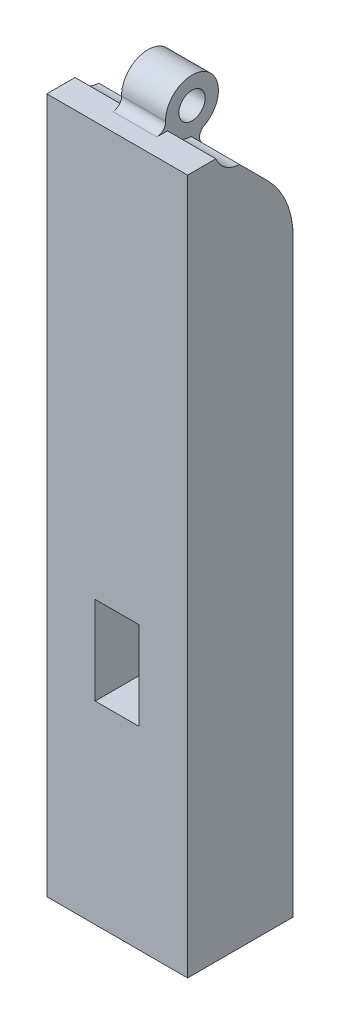
ISO-10303-21;
HEADER;
FILE_DESCRIPTION(('STEP AP214'),'2;1');
FILE_NAME('part.step','',(''),(''),'','','');
FILE_SCHEMA(('AUTOMOTIVE_DESIGN { 1 0 10303 214 1 1 1 1 }'));
ENDSEC;
DATA;
#1=APPLICATION_CONTEXT('core data for automotive mechanical design processes');
#2=APPLICATION_PROTOCOL_DEFINITION('international standard','automotive_design',2000,#1);
#3=PRODUCT_CONTEXT('',#1,'mechanical');
#4=PRODUCT('Part','Part','',(#3));
#5=PRODUCT_RELATED_PRODUCT_CATEGORY('part','',(#4));
#6=PRODUCT_DEFINITION_FORMATION('','',#4);
#7=PRODUCT_DEFINITION_CONTEXT('part definition',#1,'design');
#8=PRODUCT_DEFINITION('design','',#6,#7);
#9=PRODUCT_DEFINITION_SHAPE('','',#8);
#10=(LENGTH_UNIT() NAMED_UNIT(*) SI_UNIT(.MILLI.,.METRE.));
#11=(NAMED_UNIT(*) PLANE_ANGLE_UNIT() SI_UNIT($,.RADIAN.));
#12=(NAMED_UNIT(*) SI_UNIT($,.STERADIAN.) SOLID_ANGLE_UNIT());
#13=UNCERTAINTY_MEASURE_WITH_UNIT(LENGTH_MEASURE(1.E-05),#10,'distance_accuracy_value','');
#14=(GEOMETRIC_REPRESENTATION_CONTEXT(3) GLOBAL_UNCERTAINTY_ASSIGNED_CONTEXT((#13)) GLOBAL_UNIT_ASSIGNED_CONTEXT((#10,
#11,#12)) REPRESENTATION_CONTEXT('',''));
#15=CARTESIAN_POINT('',(0.,0.,0.));
#16=DIRECTION('',(0.,0.,1.));
#17=DIRECTION('',(1.,0.,0.));
#18=AXIS2_PLACEMENT_3D('',#15,#16,#17);
#19=CARTESIAN_POINT('',(0.,0.,0.));
#20=DIRECTION('',(0.,0.,-1.));
#21=DIRECTION('',(-1.,0.,0.));
#22=AXIS2_PLACEMENT_3D('',#19,#20,#21);
#23=PLANE('',#22);
#24=DIRECTION('',(-1.,0.,0.));
#25=VECTOR('',#24,1.);
#26=CARTESIAN_POINT('',(0.,-37.,0.));
#27=LINE('',#26,#25);
#28=CARTESIAN_POINT('',(2.50000000000001,-37.,0.));
#29=VERTEX_POINT('',#28);
#30=CARTESIAN_POINT('',(-2.49999999999999,-37.,0.));
#31=VERTEX_POINT('',#30);
#32=EDGE_CURVE('E261',#29,#31,#27,.T.);
#33=ORIENTED_EDGE('',*,*,#32,.F.);
#34=DIRECTION('',(0.,1.,0.));
#35=VECTOR('',#34,1.);
#36=CARTESIAN_POINT('',(2.5,0.,0.));
#37=LINE('',#36,#35);
#38=CARTESIAN_POINT('',(2.50000000000001,-27.,0.));
#39=VERTEX_POINT('',#38);
#40=EDGE_CURVE('E254',#29,#39,#37,.T.);
#41=ORIENTED_EDGE('',*,*,#40,.T.);
#42=DIRECTION('',(-1.,0.,0.));
#43=VECTOR('',#42,1.);
#44=CARTESIAN_POINT('',(0.,-27.,0.));
#45=LINE('',#44,#43);
#46=CARTESIAN_POINT('',(-2.49999999999999,-27.,0.));
#47=VERTEX_POINT('',#46);
#48=EDGE_CURVE('E267',#39,#47,#45,.T.);
#49=ORIENTED_EDGE('',*,*,#48,.T.);
#50=DIRECTION('',(0.,1.,0.));
#51=VECTOR('',#50,1.);
#52=CARTESIAN_POINT('',(-2.49999999999998,0.,0.));
#53=LINE('',#52,#51);
#54=EDGE_CURVE('E264',#31,#47,#53,.T.);
#55=ORIENTED_EDGE('',*,*,#54,.F.);
#56=EDGE_LOOP('',(#33,#41,#49,#55));
#57=FACE_BOUND('',#56,.T.);
#58=DIRECTION('',(0.,-1.,0.));
#59=VECTOR('',#58,1.);
#60=CARTESIAN_POINT('',(-8.,-79.,0.));
#61=LINE('',#60,#59);
#62=CARTESIAN_POINT('',(-8.,-12.1421356237309,0.));
#63=VERTEX_POINT('',#62);
#64=CARTESIAN_POINT('',(-8.,-79.,0.));
#65=VERTEX_POINT('',#64);
#66=EDGE_CURVE('E362',#63,#65,#61,.T.);
#67=ORIENTED_EDGE('',*,*,#66,.F.);
#68=DIRECTION('',(1.,0.,0.));
#69=VECTOR('',#68,1.);
#70=CARTESIAN_POINT('',(8.,-12.1421356237309,0.));
#71=LINE('',#70,#69);
#72=CARTESIAN_POINT('',(8.,-12.1421356237309,0.));
#73=VERTEX_POINT('',#72);
#74=EDGE_CURVE('E427',#63,#73,#71,.T.);
#75=ORIENTED_EDGE('',*,*,#74,.T.);
#76=DIRECTION('',(0.,1.,0.));
#77=VECTOR('',#76,1.);
#78=CARTESIAN_POINT('',(8.,0.,0.));
#79=LINE('',#78,#77);
#80=CARTESIAN_POINT('',(8.00000000000001,-79.,0.));
#81=VERTEX_POINT('',#80);
#82=EDGE_CURVE('E343',#81,#73,#79,.T.);
#83=ORIENTED_EDGE('',*,*,#82,.F.);
#84=DIRECTION('',(1.,0.,0.));
#85=VECTOR('',#84,1.);
#86=CARTESIAN_POINT('',(8.00000000000001,-79.,0.));
#87=LINE('',#86,#85);
#88=EDGE_CURVE('E349',#65,#81,#87,.T.);
#89=ORIENTED_EDGE('',*,*,#88,.F.);
#90=EDGE_LOOP('',(#67,#75,#83,#89));
#91=FACE_BOUND('',#90,.T.);
#92=DIRECTION('',(-1.,0.,0.));
#93=VECTOR('',#92,1.);
#94=CARTESIAN_POINT('',(0.,-47.,0.));
#95=LINE('',#94,#93);
#96=CARTESIAN_POINT('',(2.50000000000001,-47.,0.));
#97=VERTEX_POINT('',#96);
#98=CARTESIAN_POINT('',(-2.49999999999999,-47.,0.));
#99=VERTEX_POINT('',#98);
#100=EDGE_CURVE('E289',#97,#99,#95,.T.);
#101=ORIENTED_EDGE('',*,*,#100,.T.);
#102=DIRECTION('',(0.,-1.,0.));
#103=VECTOR('',#102,1.);
#104=CARTESIAN_POINT('',(-2.5,0.,0.));
#105=LINE('',#104,#103);
#106=CARTESIAN_POINT('',(-2.49999999999999,-57.,0.));
#107=VERTEX_POINT('',#106);
#108=EDGE_CURVE('E243',#99,#107,#105,.T.);
#109=ORIENTED_EDGE('',*,*,#108,.T.);
#110=DIRECTION('',(-1.,0.,0.));
#111=VECTOR('',#110,1.);
#112=CARTESIAN_POINT('',(0.,-57.,0.));
#113=LINE('',#112,#111);
#114=CARTESIAN_POINT('',(2.50000000000001,-57.,0.));
#115=VERTEX_POINT('',#114);
#116=EDGE_CURVE('E295',#115,#107,#113,.T.);
#117=ORIENTED_EDGE('',*,*,#116,.F.);
#118=DIRECTION('',(0.,-1.,0.));
#119=VECTOR('',#118,1.);
#120=CARTESIAN_POINT('',(2.50000000000002,0.,0.));
#121=LINE('',#120,#119);
#122=EDGE_CURVE('E202',#97,#115,#121,.T.);
#123=ORIENTED_EDGE('',*,*,#122,.F.);
#124=EDGE_LOOP('',(#101,#109,#117,#123));
#125=FACE_BOUND('',#124,.T.);
#126=ADVANCED_FACE('F38',(#57,#91,#125),#23,.T.);
#127=CARTESIAN_POINT('',(-8.,1.1,6.));
#128=DIRECTION('',(1.,0.,0.));
#129=DIRECTION('',(0.,0.,-1.));
#130=AXIS2_PLACEMENT_3D('',#127,#128,#129);
#131=CYLINDRICAL_SURFACE('',#130,3.);
#132=CARTESIAN_POINT('',(-2.5,1.1,6.));
#133=DIRECTION('',(1.,0.,0.));
#134=DIRECTION('',(0.,0.,-1.));
#135=AXIS2_PLACEMENT_3D('',#132,#133,#134);
#136=CIRCLE('',#135,3.);
#137=CARTESIAN_POINT('',(-2.5,0.,8.79105714739057));
#138=VERTEX_POINT('',#137);
#139=CARTESIAN_POINT('',(-2.5,-1.89827483579603,6.10172516420397));
#140=VERTEX_POINT('',#139);
#141=EDGE_CURVE('E319',#138,#140,#136,.T.);
#142=ORIENTED_EDGE('',*,*,#141,.T.);
#143=DIRECTION('',(1.,0.,0.));
#144=VECTOR('',#143,1.);
#145=CARTESIAN_POINT('',(-8.,-1.89827483579603,6.10172516420397));
#146=LINE('',#145,#144);
#147=CARTESIAN_POINT('',(-8.,-1.89827483579602,6.10172516420397));
#148=VERTEX_POINT('',#147);
#149=EDGE_CURVE('E383',#148,#140,#146,.T.);
#150=ORIENTED_EDGE('',*,*,#149,.F.);
#151=CARTESIAN_POINT('',(-8.,1.1,6.));
#152=DIRECTION('',(1.,0.,0.));
#153=DIRECTION('',(0.,0.,-1.));
#154=AXIS2_PLACEMENT_3D('',#151,#152,#153);
#155=CIRCLE('',#154,3.);
#156=CARTESIAN_POINT('',(-8.,0.,8.79105714739057));
#157=VERTEX_POINT('',#156);
#158=EDGE_CURVE('E326',#157,#148,#155,.T.);
#159=ORIENTED_EDGE('',*,*,#158,.F.);
#160=DIRECTION('',(1.,0.,0.));
#161=VECTOR('',#160,1.);
#162=CARTESIAN_POINT('',(-8.,0.,8.79105714739057));
#163=LINE('',#162,#161);
#164=EDGE_CURVE('E330',#138,#157,#163,.F.);
#165=ORIENTED_EDGE('',*,*,#164,.F.);
#166=EDGE_LOOP('',(#142,#150,#159,#165));
#167=FACE_BOUND('',#166,.T.);
#168=ADVANCED_FACE('F468',(#167),#131,.F.);
#169=CARTESIAN_POINT('',(8.,0.,12.));
#170=DIRECTION('',(-1.,0.,0.));
#171=DIRECTION('',(0.,-1.,0.));
#172=AXIS2_PLACEMENT_3D('',#169,#170,#171);
#173=PLANE('',#172);
#174=ORIENTED_EDGE('',*,*,#82,.T.);
#175=CARTESIAN_POINT('',(8.,-12.1421356237309,10.));
#176=DIRECTION('',(-1.,0.,0.));
#177=DIRECTION('',(0.,-1.,0.));
#178=AXIS2_PLACEMENT_3D('',#175,#176,#177);
#179=CIRCLE('',#178,10.);
#180=CARTESIAN_POINT('',(8.00000000000001,-5.07106781186547,2.92893218813453));
#181=VERTEX_POINT('',#180);
#182=EDGE_CURVE('E431',#73,#181,#179,.F.);
#183=ORIENTED_EDGE('',*,*,#182,.T.);
#184=DIRECTION('',(0.,-0.707106781186547,-0.707106781186548));
#185=VECTOR('',#184,1.);
#186=CARTESIAN_POINT('',(8.00000000000001,0.,8.));
#187=LINE('',#186,#185);
#188=CARTESIAN_POINT('',(8.00000000000001,-1.89827483579603,6.10172516420397));
#189=VERTEX_POINT('',#188);
#190=EDGE_CURVE('E335',#189,#181,#187,.T.);
#191=ORIENTED_EDGE('',*,*,#190,.F.);
#192=CARTESIAN_POINT('',(8.00000000000001,1.1,6.));
#193=DIRECTION('',(1.,0.,0.));
#194=DIRECTION('',(0.,0.,-1.));
#195=AXIS2_PLACEMENT_3D('',#192,#193,#194);
#196=CIRCLE('',#195,3.);
#197=CARTESIAN_POINT('',(8.00000000000001,0.,8.79105714739057));
#198=VERTEX_POINT('',#197);
#199=EDGE_CURVE('E317',#198,#189,#196,.T.);
#200=ORIENTED_EDGE('',*,*,#199,.F.);
#201=DIRECTION('',(0.,0.,-1.));
#202=VECTOR('',#201,1.);
#203=CARTESIAN_POINT('',(8.,0.,12.));
#204=LINE('',#203,#202);
#205=CARTESIAN_POINT('',(8.,0.,12.));
#206=VERTEX_POINT('',#205);
#207=EDGE_CURVE('E378',#206,#198,#204,.T.);
#208=ORIENTED_EDGE('',*,*,#207,.F.);
#209=DIRECTION('',(0.,1.,0.));
#210=VECTOR('',#209,1.);
#211=CARTESIAN_POINT('',(8.,0.,12.));
#212=LINE('',#211,#210);
#213=CARTESIAN_POINT('',(8.00000000000001,-79.,12.));
#214=VERTEX_POINT('',#213);
#215=EDGE_CURVE('E344',#214,#206,#212,.T.);
#216=ORIENTED_EDGE('',*,*,#215,.F.);
#217=DIRECTION('',(0.,0.,-1.));
#218=VECTOR('',#217,1.);
#219=CARTESIAN_POINT('',(8.00000000000001,-79.,12.));
#220=LINE('',#219,#218);
#221=EDGE_CURVE('E358',#214,#81,#220,.T.);
#222=ORIENTED_EDGE('',*,*,#221,.T.);
#223=EDGE_LOOP('',(#174,#183,#191,#200,#208,#216,#222));
#224=FACE_BOUND('',#223,.T.);
#225=ADVANCED_FACE('F451',(#224),#173,.F.);
#226=CARTESIAN_POINT('',(-8.,0.,12.));
#227=DIRECTION('',(0.,-1.,0.));
#228=DIRECTION('',(1.,0.,0.));
#229=AXIS2_PLACEMENT_3D('',#226,#227,#228);
#230=PLANE('',#229);
#231=DIRECTION('',(1.,0.,0.));
#232=VECTOR('',#231,1.);
#233=CARTESIAN_POINT('',(-2.5,0.,9.99874980462644));
#234=LINE('',#233,#232);
#235=CARTESIAN_POINT('',(2.5,0.,9.99874980462644));
#236=VERTEX_POINT('',#235);
#237=CARTESIAN_POINT('',(-2.5,0.,9.99874980462644));
#238=VERTEX_POINT('',#237);
#239=EDGE_CURVE('E391',#236,#238,#234,.F.);
#240=ORIENTED_EDGE('',*,*,#239,.T.);
#241=DIRECTION('',(0.,0.,-1.));
#242=VECTOR('',#241,1.);
#243=CARTESIAN_POINT('',(-2.5,0.,6.));
#244=LINE('',#243,#242);
#245=EDGE_CURVE('E395',#238,#138,#244,.T.);
#246=ORIENTED_EDGE('',*,*,#245,.T.);
#247=ORIENTED_EDGE('',*,*,#164,.T.);
#248=DIRECTION('',(0.,0.,-1.));
#249=VECTOR('',#248,1.);
#250=CARTESIAN_POINT('',(-8.,0.,12.));
#251=LINE('',#250,#249);
#252=CARTESIAN_POINT('',(-8.,0.,12.));
#253=VERTEX_POINT('',#252);
#254=EDGE_CURVE('E374',#253,#157,#251,.T.);
#255=ORIENTED_EDGE('',*,*,#254,.F.);
#256=DIRECTION('',(-1.,0.,0.));
#257=VECTOR('',#256,1.);
#258=CARTESIAN_POINT('',(-8.,0.,12.));
#259=LINE('',#258,#257);
#260=EDGE_CURVE('E348',#206,#253,#259,.T.);
#261=ORIENTED_EDGE('',*,*,#260,.F.);
#262=ORIENTED_EDGE('',*,*,#207,.T.);
#263=CARTESIAN_POINT('',(2.5,0.,8.79105714739057));
#264=VERTEX_POINT('',#263);
#265=EDGE_CURVE('E331',#198,#264,#163,.F.);
#266=ORIENTED_EDGE('',*,*,#265,.T.);
#267=DIRECTION('',(0.,0.,1.));
#268=VECTOR('',#267,1.);
#269=CARTESIAN_POINT('',(2.5,0.,12.));
#270=LINE('',#269,#268);
#271=EDGE_CURVE('E387',#264,#236,#270,.T.);
#272=ORIENTED_EDGE('',*,*,#271,.T.);
#273=EDGE_LOOP('',(#240,#246,#247,#255,#261,#262,#266,#272));
#274=FACE_BOUND('',#273,.T.);
#275=ADVANCED_FACE('F462',(#274),#230,.F.);
#276=CARTESIAN_POINT('',(-8.,-79.,12.));
#277=DIRECTION('',(1.,0.,0.));
#278=DIRECTION('',(0.,0.,-1.));
#279=AXIS2_PLACEMENT_3D('',#276,#277,#278);
#280=PLANE('',#279);
#281=DIRECTION('',(0.,-0.707106781186547,-0.707106781186548));
#282=VECTOR('',#281,1.);
#283=CARTESIAN_POINT('',(-8.,0.,8.));
#284=LINE('',#283,#282);
#285=CARTESIAN_POINT('',(-8.,-5.07106781186547,2.92893218813453));
#286=VERTEX_POINT('',#285);
#287=EDGE_CURVE('E339',#148,#286,#284,.T.);
#288=ORIENTED_EDGE('',*,*,#287,.T.);
#289=CARTESIAN_POINT('',(-8.,-12.1421356237309,10.));
#290=DIRECTION('',(1.,0.,0.));
#291=DIRECTION('',(0.,0.,-1.));
#292=AXIS2_PLACEMENT_3D('',#289,#290,#291);
#293=CIRCLE('',#292,10.);
#294=EDGE_CURVE('E11',#286,#63,#293,.F.);
#295=ORIENTED_EDGE('',*,*,#294,.T.);
#296=ORIENTED_EDGE('',*,*,#66,.T.);
#297=DIRECTION('',(0.,0.,-1.));
#298=VECTOR('',#297,1.);
#299=CARTESIAN_POINT('',(-8.,-79.,12.));
#300=LINE('',#299,#298);
#301=CARTESIAN_POINT('',(-8.,-79.,12.));
#302=VERTEX_POINT('',#301);
#303=EDGE_CURVE('E370',#302,#65,#300,.T.);
#304=ORIENTED_EDGE('',*,*,#303,.F.);
#305=DIRECTION('',(0.,-1.,0.));
#306=VECTOR('',#305,1.);
#307=CARTESIAN_POINT('',(-8.,-79.,12.));
#308=LINE('',#307,#306);
#309=EDGE_CURVE('E352',#253,#302,#308,.T.);
#310=ORIENTED_EDGE('',*,*,#309,.F.);
#311=ORIENTED_EDGE('',*,*,#254,.T.);
#312=ORIENTED_EDGE('',*,*,#158,.T.);
#313=EDGE_LOOP('',(#288,#295,#296,#304,#310,#311,#312));
#314=FACE_BOUND('',#313,.T.);
#315=ADVANCED_FACE('F442',(#314),#280,.F.);
#316=CARTESIAN_POINT('',(8.00000000000001,-79.,12.));
#317=DIRECTION('',(0.,1.,0.));
#318=DIRECTION('',(0.,0.,1.));
#319=AXIS2_PLACEMENT_3D('',#316,#317,#318);
#320=PLANE('',#319);
#321=ORIENTED_EDGE('',*,*,#88,.T.);
#322=ORIENTED_EDGE('',*,*,#221,.F.);
#323=DIRECTION('',(1.,0.,0.));
#324=VECTOR('',#323,1.);
#325=CARTESIAN_POINT('',(8.00000000000001,-79.,12.));
#326=LINE('',#325,#324);
#327=EDGE_CURVE('E355',#302,#214,#326,.T.);
#328=ORIENTED_EDGE('',*,*,#327,.F.);
#329=ORIENTED_EDGE('',*,*,#303,.T.);
#330=EDGE_LOOP('',(#321,#322,#328,#329));
#331=FACE_BOUND('',#330,.T.);
#332=ADVANCED_FACE('F457',(#331),#320,.F.);
#333=CARTESIAN_POINT('',(0.,0.,12.));
#334=DIRECTION('',(0.,0.,-1.));
#335=DIRECTION('',(-1.,0.,0.));
#336=AXIS2_PLACEMENT_3D('',#333,#334,#335);
#337=PLANE('',#336);
#338=DIRECTION('',(1.,0.,0.));
#339=VECTOR('',#338,1.);
#340=CARTESIAN_POINT('',(2.50000000000001,-47.,12.));
#341=LINE('',#340,#339);
#342=CARTESIAN_POINT('',(-2.49999999999999,-47.,12.));
#343=VERTEX_POINT('',#342);
#344=CARTESIAN_POINT('',(2.50000000000001,-47.,12.));
#345=VERTEX_POINT('',#344);
#346=EDGE_CURVE('E218',#343,#345,#341,.T.);
#347=ORIENTED_EDGE('',*,*,#346,.T.);
#348=DIRECTION('',(0.,-1.,0.));
#349=VECTOR('',#348,1.);
#350=CARTESIAN_POINT('',(2.50000000000001,-47.,12.));
#351=LINE('',#350,#349);
#352=CARTESIAN_POINT('',(2.50000000000001,-57.,12.));
#353=VERTEX_POINT('',#352);
#354=EDGE_CURVE('E199',#345,#353,#351,.T.);
#355=ORIENTED_EDGE('',*,*,#354,.T.);
#356=DIRECTION('',(-1.,0.,0.));
#357=VECTOR('',#356,1.);
#358=CARTESIAN_POINT('',(2.50000000000001,-57.,12.));
#359=LINE('',#358,#357);
#360=CARTESIAN_POINT('',(-2.49999999999999,-57.,12.));
#361=VERTEX_POINT('',#360);
#362=EDGE_CURVE('E208',#353,#361,#359,.T.);
#363=ORIENTED_EDGE('',*,*,#362,.T.);
#364=DIRECTION('',(0.,1.,0.));
#365=VECTOR('',#364,1.);
#366=CARTESIAN_POINT('',(-2.49999999999999,-47.,12.));
#367=LINE('',#366,#365);
#368=EDGE_CURVE('E213',#361,#343,#367,.T.);
#369=ORIENTED_EDGE('',*,*,#368,.T.);
#370=EDGE_LOOP('',(#347,#355,#363,#369));
#371=FACE_BOUND('',#370,.T.);
#372=ORIENTED_EDGE('',*,*,#215,.T.);
#373=ORIENTED_EDGE('',*,*,#260,.T.);
#374=ORIENTED_EDGE('',*,*,#309,.T.);
#375=ORIENTED_EDGE('',*,*,#327,.T.);
#376=EDGE_LOOP('',(#372,#373,#374,#375));
#377=FACE_BOUND('',#376,.T.);
#378=ADVANCED_FACE('F215',(#371,#377),#337,.F.);
#379=CARTESIAN_POINT('',(-8.,0.,8.));
#380=DIRECTION('',(0.,-0.707106781186548,0.707106781186547));
#381=DIRECTION('',(0.,-0.707106781186547,-0.707106781186548));
#382=AXIS2_PLACEMENT_3D('',#379,#380,#381);
#383=PLANE('',#382);
#384=ORIENTED_EDGE('',*,*,#190,.T.);
#385=DIRECTION('',(1.,0.,0.));
#386=VECTOR('',#385,1.);
#387=CARTESIAN_POINT('',(-8.,-5.07106781186547,2.92893218813453));
#388=LINE('',#387,#386);
#389=EDGE_CURVE('E47',#181,#286,#388,.F.);
#390=ORIENTED_EDGE('',*,*,#389,.T.);
#391=ORIENTED_EDGE('',*,*,#287,.F.);
#392=ORIENTED_EDGE('',*,*,#149,.T.);
#393=DIRECTION('',(0.,-0.707106781186547,-0.707106781186548));
#394=VECTOR('',#393,1.);
#395=CARTESIAN_POINT('',(-2.5,-0.449999999999999,7.55));
#396=LINE('',#395,#394);
#397=CARTESIAN_POINT('',(-2.5,-3.14991315076583,4.85008684923416));
#398=VERTEX_POINT('',#397);
#399=EDGE_CURVE('E404',#140,#398,#396,.T.);
#400=ORIENTED_EDGE('',*,*,#399,.T.);
#401=DIRECTION('',(1.,0.,0.));
#402=VECTOR('',#401,1.);
#403=CARTESIAN_POINT('',(2.5,-3.14991315076583,4.85008684923416));
#404=LINE('',#403,#402);
#405=CARTESIAN_POINT('',(2.5,-3.14991315076583,4.85008684923416));
#406=VERTEX_POINT('',#405);
#407=EDGE_CURVE('E408',#398,#406,#404,.T.);
#408=ORIENTED_EDGE('',*,*,#407,.T.);
#409=DIRECTION('',(0.,0.707106781186547,0.707106781186548));
#410=VECTOR('',#409,1.);
#411=CARTESIAN_POINT('',(2.5,0.,8.));
#412=LINE('',#411,#410);
#413=CARTESIAN_POINT('',(2.5,-1.89827483579603,6.10172516420397));
#414=VERTEX_POINT('',#413);
#415=EDGE_CURVE('E412',#406,#414,#412,.T.);
#416=ORIENTED_EDGE('',*,*,#415,.T.);
#417=EDGE_CURVE('E382',#414,#189,#146,.T.);
#418=ORIENTED_EDGE('',*,*,#417,.T.);
#419=EDGE_LOOP('',(#384,#390,#391,#392,#400,#408,#416,#418));
#420=FACE_BOUND('',#419,.T.);
#421=ADVANCED_FACE('F437',(#420),#383,.F.);
#422=ORIENTED_EDGE('',*,*,#417,.F.);
#423=CARTESIAN_POINT('',(2.5,1.1,6.));
#424=DIRECTION('',(1.,0.,0.));
#425=DIRECTION('',(0.,0.,-1.));
#426=AXIS2_PLACEMENT_3D('',#423,#424,#425);
#427=CIRCLE('',#426,3.);
#428=EDGE_CURVE('E313',#264,#414,#427,.T.);
#429=ORIENTED_EDGE('',*,*,#428,.F.);
#430=ORIENTED_EDGE('',*,*,#265,.F.);
#431=ORIENTED_EDGE('',*,*,#199,.T.);
#432=EDGE_LOOP('',(#422,#429,#430,#431));
#433=FACE_BOUND('',#432,.T.);
#434=ADVANCED_FACE('F484',(#433),#131,.F.);
#435=CARTESIAN_POINT('',(2.5,1.1,6.));
#436=DIRECTION('',(-1.,0.,0.));
#437=DIRECTION('',(0.,0.,1.));
#438=AXIS2_PLACEMENT_3D('',#435,#436,#437);
#439=CYLINDRICAL_SURFACE('',#438,3.);
#440=CARTESIAN_POINT('',(-2.5,-1.55710477718447,4.60723505103571));
#441=VERTEX_POINT('',#440);
#442=CARTESIAN_POINT('',(-2.5,1.025,8.99906235346983));
#443=VERTEX_POINT('',#442);
#444=EDGE_CURVE('E309',#441,#443,#136,.T.);
#445=ORIENTED_EDGE('',*,*,#444,.T.);
#446=DIRECTION('',(-1.,0.,0.));
#447=VECTOR('',#446,1.);
#448=CARTESIAN_POINT('',(2.5,1.025,8.99906235346983));
#449=LINE('',#448,#447);
#450=CARTESIAN_POINT('',(2.5,1.025,8.99906235346983));
#451=VERTEX_POINT('',#450);
#452=EDGE_CURVE('E401',#443,#451,#449,.F.);
#453=ORIENTED_EDGE('',*,*,#452,.T.);
#454=CARTESIAN_POINT('',(2.5,-1.55710477718447,4.60723505103571));
#455=VERTEX_POINT('',#454);
#456=EDGE_CURVE('E318',#455,#451,#427,.T.);
#457=ORIENTED_EDGE('',*,*,#456,.F.);
#458=DIRECTION('',(-1.,0.,0.));
#459=VECTOR('',#458,1.);
#460=CARTESIAN_POINT('',(2.5,-1.55710477718447,4.60723505103571));
#461=LINE('',#460,#459);
#462=EDGE_CURVE('E398',#455,#441,#461,.T.);
#463=ORIENTED_EDGE('',*,*,#462,.T.);
#464=EDGE_LOOP('',(#445,#453,#457,#463));
#465=FACE_BOUND('',#464,.T.);
#466=ADVANCED_FACE('F493',(#465),#439,.T.);
#467=CARTESIAN_POINT('',(2.5,1.1,6.));
#468=DIRECTION('',(1.,0.,0.));
#469=DIRECTION('',(0.,0.,-1.));
#470=AXIS2_PLACEMENT_3D('',#467,#468,#469);
#471=PLANE('',#470);
#472=ORIENTED_EDGE('',*,*,#428,.T.);
#473=ORIENTED_EDGE('',*,*,#415,.F.);
#474=CARTESIAN_POINT('',(2.5,-2.44280636957929,4.14298006804762));
#475=DIRECTION('',(1.,0.,0.));
#476=DIRECTION('',(0.,0.,-1.));
#477=AXIS2_PLACEMENT_3D('',#474,#475,#476);
#478=CIRCLE('',#477,1.);
#479=EDGE_CURVE('E421',#406,#455,#478,.F.);
#480=ORIENTED_EDGE('',*,*,#479,.T.);
#481=ORIENTED_EDGE('',*,*,#456,.T.);
#482=CARTESIAN_POINT('',(2.5,1.,9.99874980462644));
#483=DIRECTION('',(1.,0.,0.));
#484=DIRECTION('',(0.,0.,-1.));
#485=AXIS2_PLACEMENT_3D('',#482,#483,#484);
#486=CIRCLE('',#485,1.);
#487=EDGE_CURVE('E418',#451,#236,#486,.F.);
#488=ORIENTED_EDGE('',*,*,#487,.T.);
#489=ORIENTED_EDGE('',*,*,#271,.F.);
#490=EDGE_LOOP('',(#472,#473,#480,#481,#488,#489));
#491=FACE_BOUND('',#490,.T.);
#492=CARTESIAN_POINT('',(2.5,1.1,6.));
#493=DIRECTION('',(1.,0.,0.));
#494=DIRECTION('',(0.,0.,-1.));
#495=AXIS2_PLACEMENT_3D('',#492,#493,#494);
#496=CIRCLE('',#495,1.5);
#497=CARTESIAN_POINT('',(2.5,1.1,4.5));
#498=VERTEX_POINT('',#497);
#499=EDGE_CURVE('E305',#498,#498,#496,.T.);
#500=ORIENTED_EDGE('',*,*,#499,.F.);
#501=EDGE_LOOP('',(#500));
#502=FACE_BOUND('',#501,.T.);
#503=ADVANCED_FACE('F479',(#491,#502),#471,.T.);
#504=CARTESIAN_POINT('',(-2.5,1.1,6.));
#505=DIRECTION('',(1.,0.,0.));
#506=DIRECTION('',(0.,0.,-1.));
#507=AXIS2_PLACEMENT_3D('',#504,#505,#506);
#508=PLANE('',#507);
#509=ORIENTED_EDGE('',*,*,#141,.F.);
#510=ORIENTED_EDGE('',*,*,#245,.F.);
#511=CARTESIAN_POINT('',(-2.5,1.,9.99874980462644));
#512=DIRECTION('',(1.,0.,0.));
#513=DIRECTION('',(0.,0.,-1.));
#514=AXIS2_PLACEMENT_3D('',#511,#512,#513);
#515=CIRCLE('',#514,1.);
#516=EDGE_CURVE('E415',#238,#443,#515,.T.);
#517=ORIENTED_EDGE('',*,*,#516,.T.);
#518=ORIENTED_EDGE('',*,*,#444,.F.);
#519=CARTESIAN_POINT('',(-2.5,-2.44280636957929,4.14298006804762));
#520=DIRECTION('',(1.,0.,0.));
#521=DIRECTION('',(0.,0.,-1.));
#522=AXIS2_PLACEMENT_3D('',#519,#520,#521);
#523=CIRCLE('',#522,1.);
#524=EDGE_CURVE('E424',#441,#398,#523,.T.);
#525=ORIENTED_EDGE('',*,*,#524,.T.);
#526=ORIENTED_EDGE('',*,*,#399,.F.);
#527=EDGE_LOOP('',(#509,#510,#517,#518,#525,#526));
#528=FACE_BOUND('',#527,.T.);
#529=CARTESIAN_POINT('',(-2.5,1.1,6.));
#530=DIRECTION('',(1.,0.,0.));
#531=DIRECTION('',(0.,0.,-1.));
#532=AXIS2_PLACEMENT_3D('',#529,#530,#531);
#533=CIRCLE('',#532,1.5);
#534=CARTESIAN_POINT('',(-2.5,1.1,4.5));
#535=VERTEX_POINT('',#534);
#536=EDGE_CURVE('E277',#535,#535,#533,.T.);
#537=ORIENTED_EDGE('',*,*,#536,.T.);
#538=EDGE_LOOP('',(#537));
#539=FACE_BOUND('',#538,.T.);
#540=ADVANCED_FACE('F498',(#528,#539),#508,.F.);
#541=CARTESIAN_POINT('',(2.5,1.1,6.));
#542=DIRECTION('',(-1.,0.,0.));
#543=DIRECTION('',(0.,0.,1.));
#544=AXIS2_PLACEMENT_3D('',#541,#542,#543);
#545=CYLINDRICAL_SURFACE('',#544,1.5);
#546=ORIENTED_EDGE('',*,*,#499,.T.);
#547=EDGE_LOOP('',(#546));
#548=FACE_BOUND('',#547,.T.);
#549=ORIENTED_EDGE('',*,*,#536,.F.);
#550=EDGE_LOOP('',(#549));
#551=FACE_BOUND('',#550,.T.);
#552=ADVANCED_FACE('F501',(#548,#551),#545,.F.);
#553=CARTESIAN_POINT('',(2.5,1.,9.99874980462644));
#554=DIRECTION('',(-1.,0.,0.));
#555=DIRECTION('',(0.,0.,1.));
#556=AXIS2_PLACEMENT_3D('',#553,#554,#555);
#557=CYLINDRICAL_SURFACE('',#556,1.);
#558=ORIENTED_EDGE('',*,*,#487,.F.);
#559=ORIENTED_EDGE('',*,*,#452,.F.);
#560=ORIENTED_EDGE('',*,*,#516,.F.);
#561=ORIENTED_EDGE('',*,*,#239,.F.);
#562=EDGE_LOOP('',(#558,#559,#560,#561));
#563=FACE_BOUND('',#562,.T.);
#564=ADVANCED_FACE('F496',(#563),#557,.F.);
#565=CARTESIAN_POINT('',(2.5,-2.44280636957929,4.14298006804762));
#566=DIRECTION('',(-1.,0.,0.));
#567=DIRECTION('',(0.,0.,1.));
#568=AXIS2_PLACEMENT_3D('',#565,#566,#567);
#569=CYLINDRICAL_SURFACE('',#568,1.);
#570=ORIENTED_EDGE('',*,*,#524,.F.);
#571=ORIENTED_EDGE('',*,*,#462,.F.);
#572=ORIENTED_EDGE('',*,*,#479,.F.);
#573=ORIENTED_EDGE('',*,*,#407,.F.);
#574=EDGE_LOOP('',(#570,#571,#572,#573));
#575=FACE_BOUND('',#574,.T.);
#576=ADVANCED_FACE('F473',(#575),#569,.F.);
#577=CARTESIAN_POINT('',(0.,-12.1421356237309,10.));
#578=DIRECTION('',(-1.,0.,0.));
#579=DIRECTION('',(0.,0.,1.));
#580=AXIS2_PLACEMENT_3D('',#577,#578,#579);
#581=CYLINDRICAL_SURFACE('',#580,10.);
#582=ORIENTED_EDGE('',*,*,#294,.F.);
#583=ORIENTED_EDGE('',*,*,#389,.F.);
#584=ORIENTED_EDGE('',*,*,#182,.F.);
#585=ORIENTED_EDGE('',*,*,#74,.F.);
#586=EDGE_LOOP('',(#582,#583,#584,#585));
#587=FACE_BOUND('',#586,.T.);
#588=ADVANCED_FACE('F40',(#587),#581,.T.);
#589=CARTESIAN_POINT('',(0.,-57.,5.));
#590=DIRECTION('',(0.,-1.,0.));
#591=DIRECTION('',(0.,0.,-1.));
#592=AXIS2_PLACEMENT_3D('',#589,#590,#591);
#593=PLANE('',#592);
#594=ORIENTED_EDGE('',*,*,#116,.T.);
#595=DIRECTION('',(0.,0.,-1.));
#596=VECTOR('',#595,1.);
#597=CARTESIAN_POINT('',(-2.49999999999999,-57.,5.));
#598=LINE('',#597,#596);
#599=EDGE_CURVE('E54',#361,#107,#598,.T.);
#600=ORIENTED_EDGE('',*,*,#599,.F.);
#601=ORIENTED_EDGE('',*,*,#362,.F.);
#602=DIRECTION('',(0.,0.,-1.));
#603=VECTOR('',#602,1.);
#604=CARTESIAN_POINT('',(2.50000000000001,-57.,5.));
#605=LINE('',#604,#603);
#606=EDGE_CURVE('E195',#353,#115,#605,.T.);
#607=ORIENTED_EDGE('',*,*,#606,.T.);
#608=EDGE_LOOP('',(#594,#600,#601,#607));
#609=FACE_BOUND('',#608,.T.);
#610=ADVANCED_FACE('F209',(#609),#593,.F.);
#611=CARTESIAN_POINT('',(0.,-47.,5.));
#612=DIRECTION('',(0.,-1.,0.));
#613=DIRECTION('',(0.,0.,-1.));
#614=AXIS2_PLACEMENT_3D('',#611,#612,#613);
#615=PLANE('',#614);
#616=DIRECTION('',(1.,0.,0.));
#617=VECTOR('',#616,1.);
#618=CARTESIAN_POINT('',(-2.49999999999999,-47.,2.5));
#619=LINE('',#618,#617);
#620=CARTESIAN_POINT('',(-2.49999999999999,-47.,2.5));
#621=VERTEX_POINT('',#620);
#622=CARTESIAN_POINT('',(2.50000000000001,-47.,2.5));
#623=VERTEX_POINT('',#622);
#624=EDGE_CURVE('E239',#621,#623,#619,.T.);
#625=ORIENTED_EDGE('',*,*,#624,.F.);
#626=DIRECTION('',(0.,0.,-1.));
#627=VECTOR('',#626,1.);
#628=CARTESIAN_POINT('',(-2.49999999999999,-47.,5.));
#629=LINE('',#628,#627);
#630=EDGE_CURVE('E298',#621,#99,#629,.T.);
#631=ORIENTED_EDGE('',*,*,#630,.T.);
#632=ORIENTED_EDGE('',*,*,#100,.F.);
#633=DIRECTION('',(0.,0.,-1.));
#634=VECTOR('',#633,1.);
#635=CARTESIAN_POINT('',(2.50000000000001,-47.,5.));
#636=LINE('',#635,#634);
#637=EDGE_CURVE('E205',#623,#97,#636,.T.);
#638=ORIENTED_EDGE('',*,*,#637,.F.);
#639=EDGE_LOOP('',(#625,#631,#632,#638));
#640=FACE_BOUND('',#639,.T.);
#641=ADVANCED_FACE('F541',(#640),#615,.T.);
#642=CARTESIAN_POINT('',(0.,-37.,5.));
#643=DIRECTION('',(0.,-1.,0.));
#644=DIRECTION('',(0.,0.,-1.));
#645=AXIS2_PLACEMENT_3D('',#642,#643,#644);
#646=PLANE('',#645);
#647=DIRECTION('',(0.,0.,-1.));
#648=VECTOR('',#647,1.);
#649=CARTESIAN_POINT('',(-2.49999999999999,-37.,5.));
#650=LINE('',#649,#648);
#651=CARTESIAN_POINT('',(-2.49999999999999,-37.,2.5));
#652=VERTEX_POINT('',#651);
#653=EDGE_CURVE('E62',#652,#31,#650,.T.);
#654=ORIENTED_EDGE('',*,*,#653,.F.);
#655=DIRECTION('',(-1.,0.,0.));
#656=VECTOR('',#655,1.);
#657=CARTESIAN_POINT('',(-2.49999999999999,-37.,2.5));
#658=LINE('',#657,#656);
#659=CARTESIAN_POINT('',(2.50000000000001,-37.,2.5));
#660=VERTEX_POINT('',#659);
#661=EDGE_CURVE('E235',#660,#652,#658,.T.);
#662=ORIENTED_EDGE('',*,*,#661,.F.);
#663=DIRECTION('',(0.,0.,-1.));
#664=VECTOR('',#663,1.);
#665=CARTESIAN_POINT('',(2.50000000000001,-37.,5.));
#666=LINE('',#665,#664);
#667=EDGE_CURVE('E274',#660,#29,#666,.T.);
#668=ORIENTED_EDGE('',*,*,#667,.T.);
#669=ORIENTED_EDGE('',*,*,#32,.T.);
#670=EDGE_LOOP('',(#654,#662,#668,#669));
#671=FACE_BOUND('',#670,.T.);
#672=ADVANCED_FACE('F546',(#671),#646,.F.);
#673=CARTESIAN_POINT('',(2.5,0.,5.));
#674=DIRECTION('',(-1.,0.,0.));
#675=DIRECTION('',(0.,-1.,0.));
#676=AXIS2_PLACEMENT_3D('',#673,#674,#675);
#677=PLANE('',#676);
#678=DIRECTION('',(0.,-1.,0.));
#679=VECTOR('',#678,1.);
#680=CARTESIAN_POINT('',(2.50000000000001,4.101,2.5));
#681=LINE('',#680,#679);
#682=EDGE_CURVE('E244',#660,#623,#681,.T.);
#683=ORIENTED_EDGE('',*,*,#682,.T.);
#684=ORIENTED_EDGE('',*,*,#637,.T.);
#685=ORIENTED_EDGE('',*,*,#122,.T.);
#686=ORIENTED_EDGE('',*,*,#606,.F.);
#687=ORIENTED_EDGE('',*,*,#354,.F.);
#688=DIRECTION('',(0.,0.,-1.));
#689=VECTOR('',#688,1.);
#690=CARTESIAN_POINT('',(2.50000000000001,-47.,12.));
#691=LINE('',#690,#689);
#692=CARTESIAN_POINT('',(2.50000000000001,-47.,5.));
#693=VERTEX_POINT('',#692);
#694=EDGE_CURVE('E227',#345,#693,#691,.T.);
#695=ORIENTED_EDGE('',*,*,#694,.T.);
#696=DIRECTION('',(0.,1.,0.));
#697=VECTOR('',#696,1.);
#698=CARTESIAN_POINT('',(2.5,0.,5.));
#699=LINE('',#698,#697);
#700=CARTESIAN_POINT('',(2.50000000000001,-27.,5.));
#701=VERTEX_POINT('',#700);
#702=EDGE_CURVE('E258',#693,#701,#699,.T.);
#703=ORIENTED_EDGE('',*,*,#702,.T.);
#704=DIRECTION('',(0.,0.,-1.));
#705=VECTOR('',#704,1.);
#706=CARTESIAN_POINT('',(2.50000000000001,-27.,5.));
#707=LINE('',#706,#705);
#708=EDGE_CURVE('E278',#701,#39,#707,.T.);
#709=ORIENTED_EDGE('',*,*,#708,.T.);
#710=ORIENTED_EDGE('',*,*,#40,.F.);
#711=ORIENTED_EDGE('',*,*,#667,.F.);
#712=EDGE_LOOP('',(#683,#684,#685,#686,#687,#695,#703,#709,#710,#711));
#713=FACE_BOUND('',#712,.T.);
#714=ADVANCED_FACE('F196',(#713),#677,.T.);
#715=CARTESIAN_POINT('',(0.,-27.,5.));
#716=DIRECTION('',(0.,-1.,0.));
#717=DIRECTION('',(0.,0.,-1.));
#718=AXIS2_PLACEMENT_3D('',#715,#716,#717);
#719=PLANE('',#718);
#720=ORIENTED_EDGE('',*,*,#48,.F.);
#721=ORIENTED_EDGE('',*,*,#708,.F.);
#722=DIRECTION('',(-1.,0.,0.));
#723=VECTOR('',#722,1.);
#724=CARTESIAN_POINT('',(0.,-27.,5.));
#725=LINE('',#724,#723);
#726=CARTESIAN_POINT('',(-2.49999999999999,-27.,5.));
#727=VERTEX_POINT('',#726);
#728=EDGE_CURVE('E253',#701,#727,#725,.T.);
#729=ORIENTED_EDGE('',*,*,#728,.T.);
#730=DIRECTION('',(0.,0.,-1.));
#731=VECTOR('',#730,1.);
#732=CARTESIAN_POINT('',(-2.49999999999999,-27.,5.));
#733=LINE('',#732,#731);
#734=EDGE_CURVE('E281',#727,#47,#733,.T.);
#735=ORIENTED_EDGE('',*,*,#734,.T.);
#736=EDGE_LOOP('',(#720,#721,#729,#735));
#737=FACE_BOUND('',#736,.T.);
#738=ADVANCED_FACE('F556',(#737),#719,.T.);
#739=CARTESIAN_POINT('',(-2.49999999999998,0.,5.));
#740=DIRECTION('',(-1.,0.,0.));
#741=DIRECTION('',(0.,-1.,0.));
#742=AXIS2_PLACEMENT_3D('',#739,#740,#741);
#743=PLANE('',#742);
#744=DIRECTION('',(0.,1.,0.));
#745=VECTOR('',#744,1.);
#746=CARTESIAN_POINT('',(-2.49999999999998,0.,5.));
#747=LINE('',#746,#745);
#748=CARTESIAN_POINT('',(-2.49999999999999,-47.,5.));
#749=VERTEX_POINT('',#748);
#750=EDGE_CURVE('E250',#749,#727,#747,.T.);
#751=ORIENTED_EDGE('',*,*,#750,.F.);
#752=DIRECTION('',(0.,0.,-1.));
#753=VECTOR('',#752,1.);
#754=CARTESIAN_POINT('',(-2.49999999999999,-47.,12.));
#755=LINE('',#754,#753);
#756=EDGE_CURVE('E226',#343,#749,#755,.T.);
#757=ORIENTED_EDGE('',*,*,#756,.F.);
#758=ORIENTED_EDGE('',*,*,#368,.F.);
#759=ORIENTED_EDGE('',*,*,#599,.T.);
#760=ORIENTED_EDGE('',*,*,#108,.F.);
#761=ORIENTED_EDGE('',*,*,#630,.F.);
#762=DIRECTION('',(0.,-1.,0.));
#763=VECTOR('',#762,1.);
#764=CARTESIAN_POINT('',(-2.49999999999999,4.101,2.5));
#765=LINE('',#764,#763);
#766=EDGE_CURVE('E240',#652,#621,#765,.T.);
#767=ORIENTED_EDGE('',*,*,#766,.F.);
#768=ORIENTED_EDGE('',*,*,#653,.T.);
#769=ORIENTED_EDGE('',*,*,#54,.T.);
#770=ORIENTED_EDGE('',*,*,#734,.F.);
#771=EDGE_LOOP('',(#751,#757,#758,#759,#760,#761,#767,#768,#769,#770));
#772=FACE_BOUND('',#771,.T.);
#773=ADVANCED_FACE('F552',(#772),#743,.F.);
#774=CARTESIAN_POINT('',(0.,0.,5.));
#775=DIRECTION('',(0.,0.,-1.));
#776=DIRECTION('',(-1.,0.,0.));
#777=AXIS2_PLACEMENT_3D('',#774,#775,#776);
#778=PLANE('',#777);
#779=DIRECTION('',(1.,0.,0.));
#780=VECTOR('',#779,1.);
#781=CARTESIAN_POINT('',(0.,-47.,5.));
#782=LINE('',#781,#780);
#783=EDGE_CURVE('E230',#749,#693,#782,.T.);
#784=ORIENTED_EDGE('',*,*,#783,.F.);
#785=ORIENTED_EDGE('',*,*,#750,.T.);
#786=ORIENTED_EDGE('',*,*,#728,.F.);
#787=ORIENTED_EDGE('',*,*,#702,.F.);
#788=EDGE_LOOP('',(#784,#785,#786,#787));
#789=FACE_BOUND('',#788,.T.);
#790=ADVANCED_FACE('F555',(#789),#778,.T.);
#791=CARTESIAN_POINT('',(-2.49999999999999,4.101,2.5));
#792=DIRECTION('',(0.,0.,-1.));
#793=DIRECTION('',(-1.,0.,0.));
#794=AXIS2_PLACEMENT_3D('',#791,#792,#793);
#795=PLANE('',#794);
#796=ORIENTED_EDGE('',*,*,#661,.T.);
#797=ORIENTED_EDGE('',*,*,#766,.T.);
#798=ORIENTED_EDGE('',*,*,#624,.T.);
#799=ORIENTED_EDGE('',*,*,#682,.F.);
#800=EDGE_LOOP('',(#796,#797,#798,#799));
#801=FACE_BOUND('',#800,.T.);
#802=ADVANCED_FACE('F564',(#801),#795,.F.);
#803=CARTESIAN_POINT('',(2.50000000000001,-47.,12.));
#804=DIRECTION('',(0.,1.,0.));
#805=DIRECTION('',(0.,0.,1.));
#806=AXIS2_PLACEMENT_3D('',#803,#804,#805);
#807=PLANE('',#806);
#808=ORIENTED_EDGE('',*,*,#783,.T.);
#809=ORIENTED_EDGE('',*,*,#694,.F.);
#810=ORIENTED_EDGE('',*,*,#346,.F.);
#811=ORIENTED_EDGE('',*,*,#756,.T.);
#812=EDGE_LOOP('',(#808,#809,#810,#811));
#813=FACE_BOUND('',#812,.T.);
#814=ADVANCED_FACE('F568',(#813),#807,.F.);
#815=CLOSED_SHELL('',(#126,#168,#225,#275,#315,#332,#378,#421,#434,#466,#503,#540,#552,#564,
#576,#588,#610,#641,#672,#714,#738,#773,#790,#802,#814));
#816=MANIFOLD_SOLID_BREP('B2',#815);
#817=ADVANCED_BREP_SHAPE_REPRESENTATION('',(#18,#816),#14);
#818=SHAPE_DEFINITION_REPRESENTATION(#9,#817);
ENDSEC;
END-ISO-10303-21;
